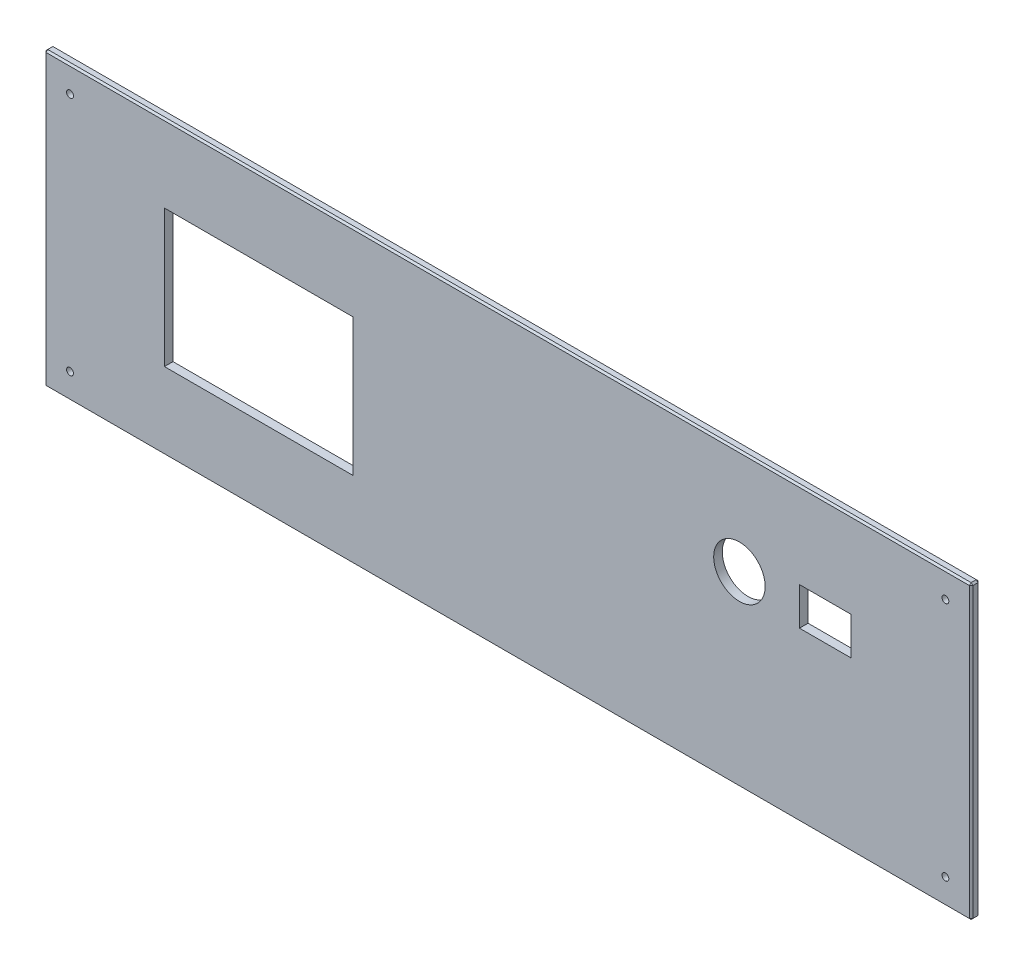
ISO-10303-21;
HEADER;
FILE_DESCRIPTION(('STEP AP214'),'2;1');
FILE_NAME('part.step','',(''),(''),'','','');
FILE_SCHEMA(('AUTOMOTIVE_DESIGN { 1 0 10303 214 1 1 1 1 }'));
ENDSEC;
DATA;
#1=APPLICATION_CONTEXT('core data for automotive mechanical design processes');
#2=APPLICATION_PROTOCOL_DEFINITION('international standard','automotive_design',2000,#1);
#3=PRODUCT_CONTEXT('',#1,'mechanical');
#4=PRODUCT('Part','Part','',(#3));
#5=PRODUCT_RELATED_PRODUCT_CATEGORY('part','',(#4));
#6=PRODUCT_DEFINITION_FORMATION('','',#4);
#7=PRODUCT_DEFINITION_CONTEXT('part definition',#1,'design');
#8=PRODUCT_DEFINITION('design','',#6,#7);
#9=PRODUCT_DEFINITION_SHAPE('','',#8);
#10=(LENGTH_UNIT() NAMED_UNIT(*) SI_UNIT(.MILLI.,.METRE.));
#11=(NAMED_UNIT(*) PLANE_ANGLE_UNIT() SI_UNIT($,.RADIAN.));
#12=(NAMED_UNIT(*) SI_UNIT($,.STERADIAN.) SOLID_ANGLE_UNIT());
#13=UNCERTAINTY_MEASURE_WITH_UNIT(LENGTH_MEASURE(1.E-05),#10,'distance_accuracy_value','');
#14=(GEOMETRIC_REPRESENTATION_CONTEXT(3) GLOBAL_UNCERTAINTY_ASSIGNED_CONTEXT((#13)) GLOBAL_UNIT_ASSIGNED_CONTEXT((#10,
#11,#12)) REPRESENTATION_CONTEXT('',''));
#15=CARTESIAN_POINT('',(0.,0.,0.));
#16=DIRECTION('',(0.,0.,1.));
#17=DIRECTION('',(1.,0.,0.));
#18=AXIS2_PLACEMENT_3D('',#15,#16,#17);
#19=CARTESIAN_POINT('',(0.,0.,5.));
#20=DIRECTION('',(1.,0.,0.));
#21=DIRECTION('',(0.,0.,-1.));
#22=AXIS2_PLACEMENT_3D('',#19,#20,#21);
#23=PLANE('',#22);
#24=DIRECTION('',(0.,0.,-1.));
#25=VECTOR('',#24,1.);
#26=CARTESIAN_POINT('',(0.,169.,5.));
#27=LINE('',#26,#25);
#28=CARTESIAN_POINT('',(0.,169.,4.));
#29=VERTEX_POINT('',#28);
#30=CARTESIAN_POINT('',(0.,169.,0.99999999999989));
#31=VERTEX_POINT('',#30);
#32=EDGE_CURVE('E373',#29,#31,#27,.T.);
#33=ORIENTED_EDGE('',*,*,#32,.T.);
#34=DIRECTION('',(0.,-1.,0.));
#35=VECTOR('',#34,1.);
#36=CARTESIAN_POINT('',(0.,0.,0.99999999999989));
#37=LINE('',#36,#35);
#38=CARTESIAN_POINT('',(0.,1.,0.99999999999989));
#39=VERTEX_POINT('',#38);
#40=EDGE_CURVE('E376',#31,#39,#37,.T.);
#41=ORIENTED_EDGE('',*,*,#40,.T.);
#42=DIRECTION('',(0.,0.,1.));
#43=VECTOR('',#42,1.);
#44=CARTESIAN_POINT('',(0.,1.,5.));
#45=LINE('',#44,#43);
#46=CARTESIAN_POINT('',(0.,1.,4.));
#47=VERTEX_POINT('',#46);
#48=EDGE_CURVE('E367',#39,#47,#45,.T.);
#49=ORIENTED_EDGE('',*,*,#48,.T.);
#50=DIRECTION('',(0.,1.,0.));
#51=VECTOR('',#50,1.);
#52=CARTESIAN_POINT('',(0.,0.,4.));
#53=LINE('',#52,#51);
#54=EDGE_CURVE('E370',#47,#29,#53,.T.);
#55=ORIENTED_EDGE('',*,*,#54,.T.);
#56=EDGE_LOOP('',(#33,#41,#49,#55));
#57=FACE_BOUND('',#56,.T.);
#58=ADVANCED_FACE('F40',(#57),#23,.F.);
#59=CARTESIAN_POINT('',(0.,0.,5.));
#60=DIRECTION('',(0.,1.,0.));
#61=DIRECTION('',(0.,0.,1.));
#62=AXIS2_PLACEMENT_3D('',#59,#60,#61);
#63=PLANE('',#62);
#64=DIRECTION('',(0.,0.,-1.));
#65=VECTOR('',#64,1.);
#66=CARTESIAN_POINT('',(0.99999999999989,0.,5.));
#67=LINE('',#66,#65);
#68=CARTESIAN_POINT('',(0.99999999999989,0.,4.));
#69=VERTEX_POINT('',#68);
#70=CARTESIAN_POINT('',(0.99999999999989,0.,0.99999999999989));
#71=VERTEX_POINT('',#70);
#72=EDGE_CURVE('E321',#69,#71,#67,.T.);
#73=ORIENTED_EDGE('',*,*,#72,.T.);
#74=DIRECTION('',(1.,0.,0.));
#75=VECTOR('',#74,1.);
#76=CARTESIAN_POINT('',(540.,0.,0.99999999999989));
#77=LINE('',#76,#75);
#78=CARTESIAN_POINT('',(539.,0.,0.99999999999989));
#79=VERTEX_POINT('',#78);
#80=EDGE_CURVE('E324',#71,#79,#77,.T.);
#81=ORIENTED_EDGE('',*,*,#80,.T.);
#82=DIRECTION('',(0.,0.,1.));
#83=VECTOR('',#82,1.);
#84=CARTESIAN_POINT('',(539.,0.,5.));
#85=LINE('',#84,#83);
#86=CARTESIAN_POINT('',(539.,0.,4.));
#87=VERTEX_POINT('',#86);
#88=EDGE_CURVE('E315',#79,#87,#85,.T.);
#89=ORIENTED_EDGE('',*,*,#88,.T.);
#90=DIRECTION('',(-1.,0.,0.));
#91=VECTOR('',#90,1.);
#92=CARTESIAN_POINT('',(0.,0.,4.));
#93=LINE('',#92,#91);
#94=EDGE_CURVE('E318',#87,#69,#93,.T.);
#95=ORIENTED_EDGE('',*,*,#94,.T.);
#96=EDGE_LOOP('',(#73,#81,#89,#95));
#97=FACE_BOUND('',#96,.T.);
#98=ADVANCED_FACE('F557',(#97),#63,.F.);
#99=CARTESIAN_POINT('',(540.,0.,5.));
#100=DIRECTION('',(-1.,0.,0.));
#101=DIRECTION('',(0.,0.,1.));
#102=AXIS2_PLACEMENT_3D('',#99,#100,#101);
#103=PLANE('',#102);
#104=DIRECTION('',(0.,0.,-1.));
#105=VECTOR('',#104,1.);
#106=CARTESIAN_POINT('',(540.,1.,5.));
#107=LINE('',#106,#105);
#108=CARTESIAN_POINT('',(540.,1.,4.));
#109=VERTEX_POINT('',#108);
#110=CARTESIAN_POINT('',(540.,1.,1.));
#111=VERTEX_POINT('',#110);
#112=EDGE_CURVE('E347',#109,#111,#107,.T.);
#113=ORIENTED_EDGE('',*,*,#112,.T.);
#114=DIRECTION('',(0.,1.,0.));
#115=VECTOR('',#114,1.);
#116=CARTESIAN_POINT('',(540.,170.,1.));
#117=LINE('',#116,#115);
#118=CARTESIAN_POINT('',(540.,169.,1.));
#119=VERTEX_POINT('',#118);
#120=EDGE_CURVE('E350',#111,#119,#117,.T.);
#121=ORIENTED_EDGE('',*,*,#120,.T.);
#122=DIRECTION('',(0.,0.,1.));
#123=VECTOR('',#122,1.);
#124=CARTESIAN_POINT('',(540.,169.,5.));
#125=LINE('',#124,#123);
#126=CARTESIAN_POINT('',(540.,169.,4.));
#127=VERTEX_POINT('',#126);
#128=EDGE_CURVE('E341',#119,#127,#125,.T.);
#129=ORIENTED_EDGE('',*,*,#128,.T.);
#130=DIRECTION('',(0.,-1.,0.));
#131=VECTOR('',#130,1.);
#132=CARTESIAN_POINT('',(540.,0.,4.));
#133=LINE('',#132,#131);
#134=EDGE_CURVE('E344',#127,#109,#133,.T.);
#135=ORIENTED_EDGE('',*,*,#134,.T.);
#136=EDGE_LOOP('',(#113,#121,#129,#135));
#137=FACE_BOUND('',#136,.T.);
#138=ADVANCED_FACE('F562',(#137),#103,.F.);
#139=CARTESIAN_POINT('',(0.,170.,5.));
#140=DIRECTION('',(0.,-1.,0.));
#141=DIRECTION('',(0.,0.,-1.));
#142=AXIS2_PLACEMENT_3D('',#139,#140,#141);
#143=PLANE('',#142);
#144=DIRECTION('',(-1.,0.,0.));
#145=VECTOR('',#144,1.);
#146=CARTESIAN_POINT('',(0.,170.,0.99999999999989));
#147=LINE('',#146,#145);
#148=CARTESIAN_POINT('',(539.,170.,0.99999999999989));
#149=VERTEX_POINT('',#148);
#150=CARTESIAN_POINT('',(0.99999999999989,170.,0.99999999999989));
#151=VERTEX_POINT('',#150);
#152=EDGE_CURVE('E360',#149,#151,#147,.T.);
#153=ORIENTED_EDGE('',*,*,#152,.T.);
#154=DIRECTION('',(0.,0.,1.));
#155=VECTOR('',#154,1.);
#156=CARTESIAN_POINT('',(0.99999999999989,170.,5.));
#157=LINE('',#156,#155);
#158=CARTESIAN_POINT('',(0.99999999999989,170.,4.00000000000011));
#159=VERTEX_POINT('',#158);
#160=EDGE_CURVE('E364',#151,#159,#157,.T.);
#161=ORIENTED_EDGE('',*,*,#160,.T.);
#162=DIRECTION('',(1.,0.,0.));
#163=VECTOR('',#162,1.);
#164=CARTESIAN_POINT('',(0.,170.,4.00000000000011));
#165=LINE('',#164,#163);
#166=CARTESIAN_POINT('',(539.,170.,4.00000000000011));
#167=VERTEX_POINT('',#166);
#168=EDGE_CURVE('E357',#159,#167,#165,.T.);
#169=ORIENTED_EDGE('',*,*,#168,.T.);
#170=DIRECTION('',(0.,0.,-1.));
#171=VECTOR('',#170,1.);
#172=CARTESIAN_POINT('',(539.,170.,5.));
#173=LINE('',#172,#171);
#174=EDGE_CURVE('E354',#167,#149,#173,.T.);
#175=ORIENTED_EDGE('',*,*,#174,.T.);
#176=EDGE_LOOP('',(#153,#161,#169,#175));
#177=FACE_BOUND('',#176,.T.);
#178=ADVANCED_FACE('F525',(#177),#143,.F.);
#179=CARTESIAN_POINT('',(0.,0.,5.));
#180=DIRECTION('',(0.,0.,-1.));
#181=DIRECTION('',(-1.,0.,0.));
#182=AXIS2_PLACEMENT_3D('',#179,#180,#181);
#183=PLANE('',#182);
#184=DIRECTION('',(1.,0.,0.));
#185=VECTOR('',#184,1.);
#186=CARTESIAN_POINT('',(0.,120.,5.));
#187=LINE('',#186,#185);
#188=CARTESIAN_POINT('',(440.,120.,5.));
#189=VERTEX_POINT('',#188);
#190=CARTESIAN_POINT('',(470.,120.,5.));
#191=VERTEX_POINT('',#190);
#192=EDGE_CURVE('E274',#189,#191,#187,.T.);
#193=ORIENTED_EDGE('',*,*,#192,.T.);
#194=DIRECTION('',(0.,-1.,0.));
#195=VECTOR('',#194,1.);
#196=CARTESIAN_POINT('',(470.,0.,5.));
#197=LINE('',#196,#195);
#198=CARTESIAN_POINT('',(470.,98.,5.));
#199=VERTEX_POINT('',#198);
#200=EDGE_CURVE('E278',#191,#199,#197,.T.);
#201=ORIENTED_EDGE('',*,*,#200,.T.);
#202=DIRECTION('',(-1.,0.,0.));
#203=VECTOR('',#202,1.);
#204=CARTESIAN_POINT('',(0.,98.,5.));
#205=LINE('',#204,#203);
#206=CARTESIAN_POINT('',(440.,98.,5.));
#207=VERTEX_POINT('',#206);
#208=EDGE_CURVE('E269',#199,#207,#205,.T.);
#209=ORIENTED_EDGE('',*,*,#208,.T.);
#210=DIRECTION('',(0.,1.,0.));
#211=VECTOR('',#210,1.);
#212=CARTESIAN_POINT('',(440.,0.,5.));
#213=LINE('',#212,#211);
#214=EDGE_CURVE('E186',#207,#189,#213,.T.);
#215=ORIENTED_EDGE('',*,*,#214,.T.);
#216=EDGE_LOOP('',(#193,#201,#209,#215));
#217=FACE_BOUND('',#216,.T.);
#218=CARTESIAN_POINT('',(405.,109.,5.));
#219=DIRECTION('',(0.,0.,-1.));
#220=DIRECTION('',(-1.,0.,0.));
#221=AXIS2_PLACEMENT_3D('',#218,#219,#220);
#222=CIRCLE('',#221,15.);
#223=CARTESIAN_POINT('',(390.,109.,5.));
#224=VERTEX_POINT('',#223);
#225=EDGE_CURVE('E265',#224,#224,#222,.T.);
#226=ORIENTED_EDGE('',*,*,#225,.T.);
#227=EDGE_LOOP('',(#226));
#228=FACE_BOUND('',#227,.T.);
#229=DIRECTION('',(1.,0.,0.));
#230=VECTOR('',#229,1.);
#231=CARTESIAN_POINT('',(0.,125.,5.));
#232=LINE('',#231,#230);
#233=CARTESIAN_POINT('',(70.0000000000001,125.,5.));
#234=VERTEX_POINT('',#233);
#235=CARTESIAN_POINT('',(180.,125.,5.));
#236=VERTEX_POINT('',#235);
#237=EDGE_CURVE('E257',#234,#236,#232,.T.);
#238=ORIENTED_EDGE('',*,*,#237,.T.);
#239=DIRECTION('',(0.,-1.,0.));
#240=VECTOR('',#239,1.);
#241=CARTESIAN_POINT('',(180.,0.,5.));
#242=LINE('',#241,#240);
#243=CARTESIAN_POINT('',(180.,45.,5.));
#244=VERTEX_POINT('',#243);
#245=EDGE_CURVE('E261',#236,#244,#242,.T.);
#246=ORIENTED_EDGE('',*,*,#245,.T.);
#247=DIRECTION('',(-1.,0.,0.));
#248=VECTOR('',#247,1.);
#249=CARTESIAN_POINT('',(0.,45.,5.));
#250=LINE('',#249,#248);
#251=CARTESIAN_POINT('',(70.0000000000001,45.,5.));
#252=VERTEX_POINT('',#251);
#253=EDGE_CURVE('E215',#244,#252,#250,.T.);
#254=ORIENTED_EDGE('',*,*,#253,.T.);
#255=DIRECTION('',(0.,1.,0.));
#256=VECTOR('',#255,1.);
#257=CARTESIAN_POINT('',(70.,0.,5.));
#258=LINE('',#257,#256);
#259=EDGE_CURVE('E253',#252,#234,#258,.T.);
#260=ORIENTED_EDGE('',*,*,#259,.T.);
#261=EDGE_LOOP('',(#238,#246,#254,#260));
#262=FACE_BOUND('',#261,.T.);
#263=CARTESIAN_POINT('',(525.,15.,5.));
#264=DIRECTION('',(0.,0.,1.));
#265=DIRECTION('',(1.,0.,0.));
#266=AXIS2_PLACEMENT_3D('',#263,#264,#265);
#267=CIRCLE('',#266,2.);
#268=CARTESIAN_POINT('',(527.,15.,5.));
#269=VERTEX_POINT('',#268);
#270=EDGE_CURVE('E296',#269,#269,#267,.T.);
#271=ORIENTED_EDGE('',*,*,#270,.F.);
#272=EDGE_LOOP('',(#271));
#273=FACE_BOUND('',#272,.T.);
#274=CARTESIAN_POINT('',(15.,155.,5.));
#275=DIRECTION('',(0.,0.,1.));
#276=DIRECTION('',(1.,0.,0.));
#277=AXIS2_PLACEMENT_3D('',#274,#275,#276);
#278=CIRCLE('',#277,2.00000000000001);
#279=CARTESIAN_POINT('',(17.,155.,5.));
#280=VERTEX_POINT('',#279);
#281=EDGE_CURVE('E287',#280,#280,#278,.T.);
#282=ORIENTED_EDGE('',*,*,#281,.F.);
#283=EDGE_LOOP('',(#282));
#284=FACE_BOUND('',#283,.T.);
#285=CARTESIAN_POINT('',(15.,15.,5.));
#286=DIRECTION('',(0.,0.,1.));
#287=DIRECTION('',(1.,0.,0.));
#288=AXIS2_PLACEMENT_3D('',#285,#286,#287);
#289=CIRCLE('',#288,2.00000000000001);
#290=CARTESIAN_POINT('',(17.,15.,5.));
#291=VERTEX_POINT('',#290);
#292=EDGE_CURVE('E282',#291,#291,#289,.T.);
#293=ORIENTED_EDGE('',*,*,#292,.F.);
#294=EDGE_LOOP('',(#293));
#295=FACE_BOUND('',#294,.T.);
#296=CARTESIAN_POINT('',(525.,155.,5.));
#297=DIRECTION('',(0.,0.,1.));
#298=DIRECTION('',(1.,0.,0.));
#299=AXIS2_PLACEMENT_3D('',#296,#297,#298);
#300=CIRCLE('',#299,2.);
#301=CARTESIAN_POINT('',(527.,155.,5.));
#302=VERTEX_POINT('',#301);
#303=EDGE_CURVE('E295',#302,#302,#300,.T.);
#304=ORIENTED_EDGE('',*,*,#303,.F.);
#305=EDGE_LOOP('',(#304));
#306=FACE_BOUND('',#305,.T.);
#307=DIRECTION('',(0.,1.,0.));
#308=VECTOR('',#307,1.);
#309=CARTESIAN_POINT('',(539.,0.,5.));
#310=LINE('',#309,#308);
#311=CARTESIAN_POINT('',(539.,0.99999999999989,5.));
#312=VERTEX_POINT('',#311);
#313=CARTESIAN_POINT('',(539.,169.,5.));
#314=VERTEX_POINT('',#313);
#315=EDGE_CURVE('E380',#312,#314,#310,.T.);
#316=ORIENTED_EDGE('',*,*,#315,.T.);
#317=DIRECTION('',(-1.,0.,0.));
#318=VECTOR('',#317,1.);
#319=CARTESIAN_POINT('',(0.,169.,5.));
#320=LINE('',#319,#318);
#321=CARTESIAN_POINT('',(0.99999999999989,169.,5.));
#322=VERTEX_POINT('',#321);
#323=EDGE_CURVE('E11',#314,#322,#320,.T.);
#324=ORIENTED_EDGE('',*,*,#323,.T.);
#325=DIRECTION('',(0.,-1.,0.));
#326=VECTOR('',#325,1.);
#327=CARTESIAN_POINT('',(0.99999999999989,0.,5.));
#328=LINE('',#327,#326);
#329=CARTESIAN_POINT('',(0.99999999999989,0.99999999999989,5.));
#330=VERTEX_POINT('',#329);
#331=EDGE_CURVE('E51',#322,#330,#328,.T.);
#332=ORIENTED_EDGE('',*,*,#331,.T.);
#333=DIRECTION('',(1.,0.,0.));
#334=VECTOR('',#333,1.);
#335=CARTESIAN_POINT('',(0.,0.99999999999989,5.));
#336=LINE('',#335,#334);
#337=EDGE_CURVE('E383',#330,#312,#336,.T.);
#338=ORIENTED_EDGE('',*,*,#337,.T.);
#339=EDGE_LOOP('',(#316,#324,#332,#338));
#340=FACE_BOUND('',#339,.T.);
#341=ADVANCED_FACE('F501',(#217,#228,#262,#273,#284,#295,#306,#340),#183,.F.);
#342=CARTESIAN_POINT('',(0.,0.,0.));
#343=DIRECTION('',(0.,0.,-1.));
#344=DIRECTION('',(-1.,0.,0.));
#345=AXIS2_PLACEMENT_3D('',#342,#343,#344);
#346=PLANE('',#345);
#347=DIRECTION('',(0.,-1.,0.));
#348=VECTOR('',#347,1.);
#349=CARTESIAN_POINT('',(470.,120.,0.));
#350=LINE('',#349,#348);
#351=CARTESIAN_POINT('',(470.,120.,0.));
#352=VERTEX_POINT('',#351);
#353=CARTESIAN_POINT('',(470.,98.,0.));
#354=VERTEX_POINT('',#353);
#355=EDGE_CURVE('E200',#352,#354,#350,.T.);
#356=ORIENTED_EDGE('',*,*,#355,.F.);
#357=DIRECTION('',(1.,0.,0.));
#358=VECTOR('',#357,1.);
#359=CARTESIAN_POINT('',(470.,120.,0.));
#360=LINE('',#359,#358);
#361=CARTESIAN_POINT('',(440.,120.,0.));
#362=VERTEX_POINT('',#361);
#363=EDGE_CURVE('E205',#362,#352,#360,.T.);
#364=ORIENTED_EDGE('',*,*,#363,.F.);
#365=DIRECTION('',(0.,1.,0.));
#366=VECTOR('',#365,1.);
#367=CARTESIAN_POINT('',(440.,120.,0.));
#368=LINE('',#367,#366);
#369=CARTESIAN_POINT('',(440.,98.,0.));
#370=VERTEX_POINT('',#369);
#371=EDGE_CURVE('E183',#370,#362,#368,.T.);
#372=ORIENTED_EDGE('',*,*,#371,.F.);
#373=DIRECTION('',(-1.,0.,0.));
#374=VECTOR('',#373,1.);
#375=CARTESIAN_POINT('',(470.,98.,0.));
#376=LINE('',#375,#374);
#377=EDGE_CURVE('E194',#354,#370,#376,.T.);
#378=ORIENTED_EDGE('',*,*,#377,.F.);
#379=EDGE_LOOP('',(#356,#364,#372,#378));
#380=FACE_BOUND('',#379,.T.);
#381=CARTESIAN_POINT('',(405.,109.,0.));
#382=DIRECTION('',(0.,0.,-1.));
#383=DIRECTION('',(-1.,0.,0.));
#384=AXIS2_PLACEMENT_3D('',#381,#382,#383);
#385=CIRCLE('',#384,15.);
#386=CARTESIAN_POINT('',(390.,109.,0.));
#387=VERTEX_POINT('',#386);
#388=EDGE_CURVE('E220',#387,#387,#385,.T.);
#389=ORIENTED_EDGE('',*,*,#388,.F.);
#390=EDGE_LOOP('',(#389));
#391=FACE_BOUND('',#390,.T.);
#392=DIRECTION('',(0.,-1.,0.));
#393=VECTOR('',#392,1.);
#394=CARTESIAN_POINT('',(180.,125.,0.));
#395=LINE('',#394,#393);
#396=CARTESIAN_POINT('',(180.,125.,0.));
#397=VERTEX_POINT('',#396);
#398=CARTESIAN_POINT('',(180.,45.,0.));
#399=VERTEX_POINT('',#398);
#400=EDGE_CURVE('E225',#397,#399,#395,.T.);
#401=ORIENTED_EDGE('',*,*,#400,.F.);
#402=DIRECTION('',(1.,0.,0.));
#403=VECTOR('',#402,1.);
#404=CARTESIAN_POINT('',(180.,125.,0.));
#405=LINE('',#404,#403);
#406=CARTESIAN_POINT('',(70.0000000000001,125.,0.));
#407=VERTEX_POINT('',#406);
#408=EDGE_CURVE('E235',#407,#397,#405,.T.);
#409=ORIENTED_EDGE('',*,*,#408,.F.);
#410=DIRECTION('',(0.,1.,0.));
#411=VECTOR('',#410,1.);
#412=CARTESIAN_POINT('',(70.0000000000001,125.,0.));
#413=LINE('',#412,#411);
#414=CARTESIAN_POINT('',(70.0000000000001,45.,0.));
#415=VERTEX_POINT('',#414);
#416=EDGE_CURVE('E231',#415,#407,#413,.T.);
#417=ORIENTED_EDGE('',*,*,#416,.F.);
#418=DIRECTION('',(-1.,0.,0.));
#419=VECTOR('',#418,1.);
#420=CARTESIAN_POINT('',(180.,45.,0.));
#421=LINE('',#420,#419);
#422=EDGE_CURVE('E228',#399,#415,#421,.T.);
#423=ORIENTED_EDGE('',*,*,#422,.F.);
#424=EDGE_LOOP('',(#401,#409,#417,#423));
#425=FACE_BOUND('',#424,.T.);
#426=CARTESIAN_POINT('',(525.,15.,0.));
#427=DIRECTION('',(0.,0.,1.));
#428=DIRECTION('',(1.,0.,0.));
#429=AXIS2_PLACEMENT_3D('',#426,#427,#428);
#430=CIRCLE('',#429,2.);
#431=CARTESIAN_POINT('',(527.,15.,0.));
#432=VERTEX_POINT('',#431);
#433=EDGE_CURVE('E291',#432,#432,#430,.T.);
#434=ORIENTED_EDGE('',*,*,#433,.T.);
#435=EDGE_LOOP('',(#434));
#436=FACE_BOUND('',#435,.T.);
#437=CARTESIAN_POINT('',(15.,155.,0.));
#438=DIRECTION('',(0.,0.,1.));
#439=DIRECTION('',(1.,0.,0.));
#440=AXIS2_PLACEMENT_3D('',#437,#438,#439);
#441=CIRCLE('',#440,2.00000000000001);
#442=CARTESIAN_POINT('',(17.,155.,0.));
#443=VERTEX_POINT('',#442);
#444=EDGE_CURVE('E300',#443,#443,#441,.T.);
#445=ORIENTED_EDGE('',*,*,#444,.T.);
#446=EDGE_LOOP('',(#445));
#447=FACE_BOUND('',#446,.T.);
#448=CARTESIAN_POINT('',(15.,15.,0.));
#449=DIRECTION('',(0.,0.,1.));
#450=DIRECTION('',(1.,0.,0.));
#451=AXIS2_PLACEMENT_3D('',#448,#449,#450);
#452=CIRCLE('',#451,2.00000000000001);
#453=CARTESIAN_POINT('',(17.,15.,0.));
#454=VERTEX_POINT('',#453);
#455=EDGE_CURVE('E283',#454,#454,#452,.T.);
#456=ORIENTED_EDGE('',*,*,#455,.T.);
#457=EDGE_LOOP('',(#456));
#458=FACE_BOUND('',#457,.T.);
#459=CARTESIAN_POINT('',(525.,155.,0.));
#460=DIRECTION('',(0.,0.,1.));
#461=DIRECTION('',(1.,0.,0.));
#462=AXIS2_PLACEMENT_3D('',#459,#460,#461);
#463=CIRCLE('',#462,2.);
#464=CARTESIAN_POINT('',(527.,155.,0.));
#465=VERTEX_POINT('',#464);
#466=EDGE_CURVE('E307',#465,#465,#463,.T.);
#467=ORIENTED_EDGE('',*,*,#466,.T.);
#468=EDGE_LOOP('',(#467));
#469=FACE_BOUND('',#468,.T.);
#470=DIRECTION('',(0.,-1.,0.));
#471=VECTOR('',#470,1.);
#472=CARTESIAN_POINT('',(539.,0.,0.));
#473=LINE('',#472,#471);
#474=CARTESIAN_POINT('',(539.,169.,0.));
#475=VERTEX_POINT('',#474);
#476=CARTESIAN_POINT('',(539.,1.,0.));
#477=VERTEX_POINT('',#476);
#478=EDGE_CURVE('E334',#475,#477,#473,.T.);
#479=ORIENTED_EDGE('',*,*,#478,.T.);
#480=DIRECTION('',(-1.,0.,0.));
#481=VECTOR('',#480,1.);
#482=CARTESIAN_POINT('',(0.,1.,0.));
#483=LINE('',#482,#481);
#484=CARTESIAN_POINT('',(1.,1.,0.));
#485=VERTEX_POINT('',#484);
#486=EDGE_CURVE('E337',#477,#485,#483,.T.);
#487=ORIENTED_EDGE('',*,*,#486,.T.);
#488=DIRECTION('',(0.,1.,0.));
#489=VECTOR('',#488,1.);
#490=CARTESIAN_POINT('',(1.,170.,0.));
#491=LINE('',#490,#489);
#492=CARTESIAN_POINT('',(1.,169.,0.));
#493=VERTEX_POINT('',#492);
#494=EDGE_CURVE('E328',#485,#493,#491,.T.);
#495=ORIENTED_EDGE('',*,*,#494,.T.);
#496=DIRECTION('',(1.,0.,0.));
#497=VECTOR('',#496,1.);
#498=CARTESIAN_POINT('',(540.,169.,0.));
#499=LINE('',#498,#497);
#500=EDGE_CURVE('E331',#493,#475,#499,.T.);
#501=ORIENTED_EDGE('',*,*,#500,.T.);
#502=EDGE_LOOP('',(#479,#487,#495,#501));
#503=FACE_BOUND('',#502,.T.);
#504=ADVANCED_FACE('F202',(#380,#391,#425,#436,#447,#458,#469,#503),#346,.T.);
#505=CARTESIAN_POINT('',(0.,169.,5.));
#506=DIRECTION('',(0.,-0.707106781186508,-0.707106781186587));
#507=DIRECTION('',(-1.,0.,0.));
#508=AXIS2_PLACEMENT_3D('',#505,#506,#507);
#509=PLANE('',#508);
#510=DIRECTION('',(0.,-0.707106781186587,0.707106781186508));
#511=VECTOR('',#510,1.);
#512=CARTESIAN_POINT('',(0.99999999999989,169.,5.));
#513=LINE('',#512,#511);
#514=EDGE_CURVE('E45',#322,#159,#513,.F.);
#515=ORIENTED_EDGE('',*,*,#514,.F.);
#516=ORIENTED_EDGE('',*,*,#323,.F.);
#517=DIRECTION('',(0.,0.707106781186587,-0.707106781186508));
#518=VECTOR('',#517,1.);
#519=CARTESIAN_POINT('',(539.,170.,4.00000000000011));
#520=LINE('',#519,#518);
#521=EDGE_CURVE('E469',#167,#314,#520,.F.);
#522=ORIENTED_EDGE('',*,*,#521,.F.);
#523=ORIENTED_EDGE('',*,*,#168,.F.);
#524=EDGE_LOOP('',(#515,#516,#522,#523));
#525=FACE_BOUND('',#524,.T.);
#526=ADVANCED_FACE('F43',(#525),#509,.F.);
#527=CARTESIAN_POINT('',(0.99999999999989,169.,5.));
#528=DIRECTION('',(-0.57735026918969,0.577350269189562,0.577350269189626));
#529=DIRECTION('',(0.707106781186508,0.,0.707106781186587));
#530=AXIS2_PLACEMENT_3D('',#527,#528,#529);
#531=PLANE('',#530);
#532=DIRECTION('',(-0.707106781186508,0.,-0.707106781186587));
#533=VECTOR('',#532,1.);
#534=CARTESIAN_POINT('',(0.99999999999989,169.,5.));
#535=LINE('',#534,#533);
#536=EDGE_CURVE('E462',#322,#29,#535,.T.);
#537=ORIENTED_EDGE('',*,*,#536,.F.);
#538=ORIENTED_EDGE('',*,*,#514,.T.);
#539=DIRECTION('',(0.707106781186508,0.707106781186587,0.));
#540=VECTOR('',#539,1.);
#541=CARTESIAN_POINT('',(0.499999999999945,169.5,4.00000000000006));
#542=LINE('',#541,#540);
#543=EDGE_CURVE('E466',#29,#159,#542,.T.);
#544=ORIENTED_EDGE('',*,*,#543,.F.);
#545=EDGE_LOOP('',(#537,#538,#544));
#546=FACE_BOUND('',#545,.T.);
#547=ADVANCED_FACE('F482',(#546),#531,.T.);
#548=CARTESIAN_POINT('',(539.,170.,4.00000000000011));
#549=DIRECTION('',(0.57735026918969,0.577350269189562,0.577350269189626));
#550=DIRECTION('',(0.707106781186508,0.,-0.707106781186587));
#551=AXIS2_PLACEMENT_3D('',#548,#549,#550);
#552=PLANE('',#551);
#553=DIRECTION('',(0.707106781186508,-0.707106781186587,0.));
#554=VECTOR('',#553,1.);
#555=CARTESIAN_POINT('',(539.,170.,4.00000000000011));
#556=LINE('',#555,#554);
#557=EDGE_CURVE('E454',#167,#127,#556,.T.);
#558=ORIENTED_EDGE('',*,*,#557,.F.);
#559=ORIENTED_EDGE('',*,*,#521,.T.);
#560=DIRECTION('',(-0.707106781186508,0.,0.707106781186587));
#561=VECTOR('',#560,1.);
#562=CARTESIAN_POINT('',(539.5,169.,4.5));
#563=LINE('',#562,#561);
#564=EDGE_CURVE('E458',#127,#314,#563,.T.);
#565=ORIENTED_EDGE('',*,*,#564,.F.);
#566=EDGE_LOOP('',(#558,#559,#565));
#567=FACE_BOUND('',#566,.T.);
#568=ADVANCED_FACE('F518',(#567),#552,.T.);
#569=CARTESIAN_POINT('',(0.,169.,5.));
#570=DIRECTION('',(0.707106781186587,-0.707106781186508,0.));
#571=DIRECTION('',(0.,0.,-1.));
#572=AXIS2_PLACEMENT_3D('',#569,#570,#571);
#573=PLANE('',#572);
#574=ORIENTED_EDGE('',*,*,#543,.T.);
#575=ORIENTED_EDGE('',*,*,#160,.F.);
#576=DIRECTION('',(-0.707106781186508,-0.707106781186587,0.));
#577=VECTOR('',#576,1.);
#578=CARTESIAN_POINT('',(0.99999999999989,170.,0.99999999999989));
#579=LINE('',#578,#577);
#580=EDGE_CURVE('E447',#31,#151,#579,.F.);
#581=ORIENTED_EDGE('',*,*,#580,.F.);
#582=ORIENTED_EDGE('',*,*,#32,.F.);
#583=EDGE_LOOP('',(#574,#575,#581,#582));
#584=FACE_BOUND('',#583,.T.);
#585=ADVANCED_FACE('F489',(#584),#573,.F.);
#586=CARTESIAN_POINT('',(0.99999999999989,0.,5.));
#587=DIRECTION('',(0.707106781186587,0.,-0.707106781186508));
#588=DIRECTION('',(0.,-1.,0.));
#589=AXIS2_PLACEMENT_3D('',#586,#587,#588);
#590=PLANE('',#589);
#591=ORIENTED_EDGE('',*,*,#536,.T.);
#592=ORIENTED_EDGE('',*,*,#54,.F.);
#593=DIRECTION('',(0.707106781186508,0.,0.707106781186587));
#594=VECTOR('',#593,1.);
#595=CARTESIAN_POINT('',(0.99999999999989,0.99999999999989,5.));
#596=LINE('',#595,#594);
#597=EDGE_CURVE('E443',#330,#47,#596,.F.);
#598=ORIENTED_EDGE('',*,*,#597,.F.);
#599=ORIENTED_EDGE('',*,*,#331,.F.);
#600=EDGE_LOOP('',(#591,#592,#598,#599));
#601=FACE_BOUND('',#600,.T.);
#602=ADVANCED_FACE('F498',(#601),#590,.F.);
#603=CARTESIAN_POINT('',(0.,0.99999999999989,5.));
#604=DIRECTION('',(0.,0.707106781186587,-0.707106781186508));
#605=DIRECTION('',(1.,0.,0.));
#606=AXIS2_PLACEMENT_3D('',#603,#604,#605);
#607=PLANE('',#606);
#608=DIRECTION('',(0.,0.707106781186508,0.707106781186587));
#609=VECTOR('',#608,1.);
#610=CARTESIAN_POINT('',(539.,0.99999999999989,5.));
#611=LINE('',#610,#609);
#612=EDGE_CURVE('E435',#312,#87,#611,.F.);
#613=ORIENTED_EDGE('',*,*,#612,.F.);
#614=ORIENTED_EDGE('',*,*,#337,.F.);
#615=DIRECTION('',(0.,-0.707106781186508,-0.707106781186587));
#616=VECTOR('',#615,1.);
#617=CARTESIAN_POINT('',(0.99999999999989,0.99999999999989,5.));
#618=LINE('',#617,#616);
#619=EDGE_CURVE('E439',#69,#330,#618,.F.);
#620=ORIENTED_EDGE('',*,*,#619,.F.);
#621=ORIENTED_EDGE('',*,*,#94,.F.);
#622=EDGE_LOOP('',(#613,#614,#620,#621));
#623=FACE_BOUND('',#622,.T.);
#624=ADVANCED_FACE('F506',(#623),#607,.F.);
#625=CARTESIAN_POINT('',(539.,0.,5.));
#626=DIRECTION('',(-0.707106781186587,0.,-0.707106781186508));
#627=DIRECTION('',(0.,1.,0.));
#628=AXIS2_PLACEMENT_3D('',#625,#626,#627);
#629=PLANE('',#628);
#630=ORIENTED_EDGE('',*,*,#564,.T.);
#631=ORIENTED_EDGE('',*,*,#315,.F.);
#632=DIRECTION('',(0.707106781186508,0.,-0.707106781186587));
#633=VECTOR('',#632,1.);
#634=CARTESIAN_POINT('',(539.,0.99999999999989,5.));
#635=LINE('',#634,#633);
#636=EDGE_CURVE('E431',#109,#312,#635,.F.);
#637=ORIENTED_EDGE('',*,*,#636,.F.);
#638=ORIENTED_EDGE('',*,*,#134,.F.);
#639=EDGE_LOOP('',(#630,#631,#637,#638));
#640=FACE_BOUND('',#639,.T.);
#641=ADVANCED_FACE('F516',(#640),#629,.F.);
#642=CARTESIAN_POINT('',(539.,170.,5.));
#643=DIRECTION('',(-0.707106781186587,-0.707106781186508,0.));
#644=DIRECTION('',(0.,0.,-1.));
#645=AXIS2_PLACEMENT_3D('',#642,#643,#644);
#646=PLANE('',#645);
#647=ORIENTED_EDGE('',*,*,#557,.T.);
#648=ORIENTED_EDGE('',*,*,#128,.F.);
#649=DIRECTION('',(-0.707106781186508,0.707106781186587,0.));
#650=VECTOR('',#649,1.);
#651=CARTESIAN_POINT('',(540.,169.,1.));
#652=LINE('',#651,#650);
#653=EDGE_CURVE('E427',#149,#119,#652,.F.);
#654=ORIENTED_EDGE('',*,*,#653,.F.);
#655=ORIENTED_EDGE('',*,*,#174,.F.);
#656=EDGE_LOOP('',(#647,#648,#654,#655));
#657=FACE_BOUND('',#656,.T.);
#658=ADVANCED_FACE('F522',(#657),#646,.F.);
#659=CARTESIAN_POINT('',(0.,170.,0.99999999999989));
#660=DIRECTION('',(0.,0.707106781186508,-0.707106781186587));
#661=DIRECTION('',(1.,0.,0.));
#662=AXIS2_PLACEMENT_3D('',#659,#660,#661);
#663=PLANE('',#662);
#664=DIRECTION('',(0.,-0.707106781186587,-0.707106781186508));
#665=VECTOR('',#664,1.);
#666=CARTESIAN_POINT('',(0.99999999999989,170.,0.99999999999989));
#667=LINE('',#666,#665);
#668=EDGE_CURVE('E450',#151,#493,#667,.T.);
#669=ORIENTED_EDGE('',*,*,#668,.F.);
#670=ORIENTED_EDGE('',*,*,#152,.F.);
#671=DIRECTION('',(0.,0.707106781186587,0.707106781186508));
#672=VECTOR('',#671,1.);
#673=CARTESIAN_POINT('',(539.,169.5,0.499999999999945));
#674=LINE('',#673,#672);
#675=EDGE_CURVE('E423',#475,#149,#674,.T.);
#676=ORIENTED_EDGE('',*,*,#675,.F.);
#677=ORIENTED_EDGE('',*,*,#500,.F.);
#678=EDGE_LOOP('',(#669,#670,#676,#677));
#679=FACE_BOUND('',#678,.T.);
#680=ADVANCED_FACE('F529',(#679),#663,.T.);
#681=CARTESIAN_POINT('',(0.99999999999989,170.,0.99999999999989));
#682=DIRECTION('',(-0.577350269189626,0.577350269189562,-0.57735026918969));
#683=DIRECTION('',(-0.707106781186587,0.,0.707106781186508));
#684=AXIS2_PLACEMENT_3D('',#681,#682,#683);
#685=PLANE('',#684);
#686=ORIENTED_EDGE('',*,*,#580,.T.);
#687=ORIENTED_EDGE('',*,*,#668,.T.);
#688=DIRECTION('',(-0.707106781186587,0.,0.707106781186508));
#689=VECTOR('',#688,1.);
#690=CARTESIAN_POINT('',(0.5,169.,0.499999999999945));
#691=LINE('',#690,#689);
#692=EDGE_CURVE('E419',#31,#493,#691,.F.);
#693=ORIENTED_EDGE('',*,*,#692,.F.);
#694=EDGE_LOOP('',(#686,#687,#693));
#695=FACE_BOUND('',#694,.T.);
#696=ADVANCED_FACE('F533',(#695),#685,.T.);
#697=CARTESIAN_POINT('',(0.99999999999989,0.99999999999989,5.));
#698=DIRECTION('',(-0.57735026918969,-0.577350269189626,0.577350269189562));
#699=DIRECTION('',(0.707106781186508,-0.707106781186587,0.));
#700=AXIS2_PLACEMENT_3D('',#697,#698,#699);
#701=PLANE('',#700);
#702=ORIENTED_EDGE('',*,*,#619,.T.);
#703=ORIENTED_EDGE('',*,*,#597,.T.);
#704=DIRECTION('',(-0.707106781186508,0.707106781186587,0.));
#705=VECTOR('',#704,1.);
#706=CARTESIAN_POINT('',(0.499999999999945,0.5,4.));
#707=LINE('',#706,#705);
#708=EDGE_CURVE('E415',#69,#47,#707,.T.);
#709=ORIENTED_EDGE('',*,*,#708,.F.);
#710=EDGE_LOOP('',(#702,#703,#709));
#711=FACE_BOUND('',#710,.T.);
#712=ADVANCED_FACE('F545',(#711),#701,.T.);
#713=CARTESIAN_POINT('',(539.,0.99999999999989,5.));
#714=DIRECTION('',(0.57735026918969,-0.577350269189626,0.577350269189562));
#715=DIRECTION('',(0.707106781186508,0.707106781186587,0.));
#716=AXIS2_PLACEMENT_3D('',#713,#714,#715);
#717=PLANE('',#716);
#718=ORIENTED_EDGE('',*,*,#636,.T.);
#719=ORIENTED_EDGE('',*,*,#612,.T.);
#720=DIRECTION('',(-0.707106781186508,-0.707106781186587,0.));
#721=VECTOR('',#720,1.);
#722=CARTESIAN_POINT('',(539.5,0.500000000000001,4.));
#723=LINE('',#722,#721);
#724=EDGE_CURVE('E411',#109,#87,#723,.T.);
#725=ORIENTED_EDGE('',*,*,#724,.F.);
#726=EDGE_LOOP('',(#718,#719,#725));
#727=FACE_BOUND('',#726,.T.);
#728=ADVANCED_FACE('F512',(#727),#717,.T.);
#729=CARTESIAN_POINT('',(540.,169.,1.));
#730=DIRECTION('',(0.57735026918969,0.577350269189562,-0.577350269189626));
#731=DIRECTION('',(-0.707106781186508,0.,-0.707106781186587));
#732=AXIS2_PLACEMENT_3D('',#729,#730,#731);
#733=PLANE('',#732);
#734=ORIENTED_EDGE('',*,*,#675,.T.);
#735=ORIENTED_EDGE('',*,*,#653,.T.);
#736=DIRECTION('',(-0.707106781186508,0.,-0.707106781186587));
#737=VECTOR('',#736,1.);
#738=CARTESIAN_POINT('',(540.,169.,1.));
#739=LINE('',#738,#737);
#740=EDGE_CURVE('E408',#475,#119,#739,.F.);
#741=ORIENTED_EDGE('',*,*,#740,.F.);
#742=EDGE_LOOP('',(#734,#735,#741));
#743=FACE_BOUND('',#742,.T.);
#744=ADVANCED_FACE('F552',(#743),#733,.T.);
#745=CARTESIAN_POINT('',(0.,0.,0.99999999999989));
#746=DIRECTION('',(-0.707106781186508,0.,-0.707106781186587));
#747=DIRECTION('',(0.,1.,0.));
#748=AXIS2_PLACEMENT_3D('',#745,#746,#747);
#749=PLANE('',#748);
#750=ORIENTED_EDGE('',*,*,#692,.T.);
#751=ORIENTED_EDGE('',*,*,#494,.F.);
#752=DIRECTION('',(0.707106781186587,0.,-0.707106781186508));
#753=VECTOR('',#752,1.);
#754=CARTESIAN_POINT('',(1.,1.,0.));
#755=LINE('',#754,#753);
#756=EDGE_CURVE('E404',#39,#485,#755,.T.);
#757=ORIENTED_EDGE('',*,*,#756,.F.);
#758=ORIENTED_EDGE('',*,*,#40,.F.);
#759=EDGE_LOOP('',(#750,#751,#757,#758));
#760=FACE_BOUND('',#759,.T.);
#761=ADVANCED_FACE('F536',(#760),#749,.T.);
#762=CARTESIAN_POINT('',(0.99999999999989,0.,5.));
#763=DIRECTION('',(0.707106781186587,0.707106781186508,0.));
#764=DIRECTION('',(0.,0.,-1.));
#765=AXIS2_PLACEMENT_3D('',#762,#763,#764);
#766=PLANE('',#765);
#767=ORIENTED_EDGE('',*,*,#708,.T.);
#768=ORIENTED_EDGE('',*,*,#48,.F.);
#769=DIRECTION('',(0.707106781186508,-0.707106781186587,0.));
#770=VECTOR('',#769,1.);
#771=CARTESIAN_POINT('',(0.499999999999945,0.500000000000001,0.99999999999989));
#772=LINE('',#771,#770);
#773=EDGE_CURVE('E401',#71,#39,#772,.F.);
#774=ORIENTED_EDGE('',*,*,#773,.F.);
#775=ORIENTED_EDGE('',*,*,#72,.F.);
#776=EDGE_LOOP('',(#767,#768,#774,#775));
#777=FACE_BOUND('',#776,.T.);
#778=ADVANCED_FACE('F542',(#777),#766,.F.);
#779=CARTESIAN_POINT('',(540.,1.,5.));
#780=DIRECTION('',(-0.707106781186587,0.707106781186508,0.));
#781=DIRECTION('',(0.,0.,-1.));
#782=AXIS2_PLACEMENT_3D('',#779,#780,#781);
#783=PLANE('',#782);
#784=ORIENTED_EDGE('',*,*,#724,.T.);
#785=ORIENTED_EDGE('',*,*,#88,.F.);
#786=DIRECTION('',(0.707106781186508,0.707106781186587,0.));
#787=VECTOR('',#786,1.);
#788=CARTESIAN_POINT('',(539.,0.,0.99999999999989));
#789=LINE('',#788,#787);
#790=EDGE_CURVE('E397',#111,#79,#789,.F.);
#791=ORIENTED_EDGE('',*,*,#790,.F.);
#792=ORIENTED_EDGE('',*,*,#112,.F.);
#793=EDGE_LOOP('',(#784,#785,#791,#792));
#794=FACE_BOUND('',#793,.T.);
#795=ADVANCED_FACE('F595',(#794),#783,.F.);
#796=CARTESIAN_POINT('',(540.,0.,1.));
#797=DIRECTION('',(0.707106781186587,0.,-0.707106781186508));
#798=DIRECTION('',(0.,-1.,0.));
#799=AXIS2_PLACEMENT_3D('',#796,#797,#798);
#800=PLANE('',#799);
#801=ORIENTED_EDGE('',*,*,#740,.T.);
#802=ORIENTED_EDGE('',*,*,#120,.F.);
#803=DIRECTION('',(0.707106781186508,0.,0.707106781186587));
#804=VECTOR('',#803,1.);
#805=CARTESIAN_POINT('',(539.5,1.,0.500000000000001));
#806=LINE('',#805,#804);
#807=EDGE_CURVE('E393',#477,#111,#806,.T.);
#808=ORIENTED_EDGE('',*,*,#807,.F.);
#809=ORIENTED_EDGE('',*,*,#478,.F.);
#810=EDGE_LOOP('',(#801,#802,#808,#809));
#811=FACE_BOUND('',#810,.T.);
#812=ADVANCED_FACE('F589',(#811),#800,.T.);
#813=CARTESIAN_POINT('',(1.,1.,0.));
#814=DIRECTION('',(-0.577350269189626,-0.577350269189562,-0.57735026918969));
#815=DIRECTION('',(-0.707106781186587,0.,0.707106781186508));
#816=AXIS2_PLACEMENT_3D('',#813,#814,#815);
#817=PLANE('',#816);
#818=ORIENTED_EDGE('',*,*,#773,.T.);
#819=ORIENTED_EDGE('',*,*,#756,.T.);
#820=DIRECTION('',(0.,-0.707106781186587,0.707106781186508));
#821=VECTOR('',#820,1.);
#822=CARTESIAN_POINT('',(1.,1.,0.));
#823=LINE('',#822,#821);
#824=EDGE_CURVE('E390',#71,#485,#823,.F.);
#825=ORIENTED_EDGE('',*,*,#824,.F.);
#826=EDGE_LOOP('',(#818,#819,#825));
#827=FACE_BOUND('',#826,.T.);
#828=ADVANCED_FACE('F582',(#827),#817,.T.);
#829=CARTESIAN_POINT('',(539.,0.,0.99999999999989));
#830=DIRECTION('',(0.57735026918969,-0.577350269189562,-0.577350269189626));
#831=DIRECTION('',(-0.707106781186508,0.,-0.707106781186587));
#832=AXIS2_PLACEMENT_3D('',#829,#830,#831);
#833=PLANE('',#832);
#834=ORIENTED_EDGE('',*,*,#807,.T.);
#835=ORIENTED_EDGE('',*,*,#790,.T.);
#836=DIRECTION('',(0.,0.707106781186587,-0.707106781186508));
#837=VECTOR('',#836,1.);
#838=CARTESIAN_POINT('',(539.,0.,0.99999999999989));
#839=LINE('',#838,#837);
#840=EDGE_CURVE('E311',#477,#79,#839,.F.);
#841=ORIENTED_EDGE('',*,*,#840,.F.);
#842=EDGE_LOOP('',(#834,#835,#841));
#843=FACE_BOUND('',#842,.T.);
#844=ADVANCED_FACE('F575',(#843),#833,.T.);
#845=CARTESIAN_POINT('',(0.,0.,0.99999999999989));
#846=DIRECTION('',(0.,-0.707106781186508,-0.707106781186587));
#847=DIRECTION('',(-1.,0.,0.));
#848=AXIS2_PLACEMENT_3D('',#845,#846,#847);
#849=PLANE('',#848);
#850=ORIENTED_EDGE('',*,*,#824,.T.);
#851=ORIENTED_EDGE('',*,*,#486,.F.);
#852=ORIENTED_EDGE('',*,*,#840,.T.);
#853=ORIENTED_EDGE('',*,*,#80,.F.);
#854=EDGE_LOOP('',(#850,#851,#852,#853));
#855=FACE_BOUND('',#854,.T.);
#856=ADVANCED_FACE('F568',(#855),#849,.T.);
#857=CARTESIAN_POINT('',(525.,155.,0.));
#858=DIRECTION('',(0.,0.,1.));
#859=DIRECTION('',(1.,0.,0.));
#860=AXIS2_PLACEMENT_3D('',#857,#858,#859);
#861=CYLINDRICAL_SURFACE('',#860,2.);
#862=ORIENTED_EDGE('',*,*,#466,.F.);
#863=EDGE_LOOP('',(#862));
#864=FACE_BOUND('',#863,.T.);
#865=ORIENTED_EDGE('',*,*,#303,.T.);
#866=EDGE_LOOP('',(#865));
#867=FACE_BOUND('',#866,.T.);
#868=ADVANCED_FACE('F574',(#864,#867),#861,.F.);
#869=CARTESIAN_POINT('',(15.,15.,0.));
#870=DIRECTION('',(0.,0.,1.));
#871=DIRECTION('',(1.,0.,0.));
#872=AXIS2_PLACEMENT_3D('',#869,#870,#871);
#873=CYLINDRICAL_SURFACE('',#872,2.00000000000001);
#874=ORIENTED_EDGE('',*,*,#455,.F.);
#875=EDGE_LOOP('',(#874));
#876=FACE_BOUND('',#875,.T.);
#877=ORIENTED_EDGE('',*,*,#292,.T.);
#878=EDGE_LOOP('',(#877));
#879=FACE_BOUND('',#878,.T.);
#880=ADVANCED_FACE('F817',(#876,#879),#873,.F.);
#881=CARTESIAN_POINT('',(15.,155.,0.));
#882=DIRECTION('',(0.,0.,1.));
#883=DIRECTION('',(1.,0.,0.));
#884=AXIS2_PLACEMENT_3D('',#881,#882,#883);
#885=CYLINDRICAL_SURFACE('',#884,2.00000000000001);
#886=ORIENTED_EDGE('',*,*,#444,.F.);
#887=EDGE_LOOP('',(#886));
#888=FACE_BOUND('',#887,.T.);
#889=ORIENTED_EDGE('',*,*,#281,.T.);
#890=EDGE_LOOP('',(#889));
#891=FACE_BOUND('',#890,.T.);
#892=ADVANCED_FACE('F825',(#888,#891),#885,.F.);
#893=CARTESIAN_POINT('',(525.,15.,0.));
#894=DIRECTION('',(0.,0.,1.));
#895=DIRECTION('',(1.,0.,0.));
#896=AXIS2_PLACEMENT_3D('',#893,#894,#895);
#897=CYLINDRICAL_SURFACE('',#896,2.);
#898=ORIENTED_EDGE('',*,*,#433,.F.);
#899=EDGE_LOOP('',(#898));
#900=FACE_BOUND('',#899,.T.);
#901=ORIENTED_EDGE('',*,*,#270,.T.);
#902=EDGE_LOOP('',(#901));
#903=FACE_BOUND('',#902,.T.);
#904=ADVANCED_FACE('F834',(#900,#903),#897,.F.);
#905=CARTESIAN_POINT('',(180.,125.,10.));
#906=DIRECTION('',(1.,0.,0.));
#907=DIRECTION('',(0.,0.,-1.));
#908=AXIS2_PLACEMENT_3D('',#905,#906,#907);
#909=PLANE('',#908);
#910=DIRECTION('',(0.,0.,-1.));
#911=VECTOR('',#910,1.);
#912=CARTESIAN_POINT('',(180.,125.,10.));
#913=LINE('',#912,#911);
#914=EDGE_CURVE('E224',#236,#397,#913,.T.);
#915=ORIENTED_EDGE('',*,*,#914,.T.);
#916=ORIENTED_EDGE('',*,*,#400,.T.);
#917=DIRECTION('',(0.,0.,-1.));
#918=VECTOR('',#917,1.);
#919=CARTESIAN_POINT('',(180.,45.,10.));
#920=LINE('',#919,#918);
#921=EDGE_CURVE('E239',#244,#399,#920,.T.);
#922=ORIENTED_EDGE('',*,*,#921,.F.);
#923=ORIENTED_EDGE('',*,*,#245,.F.);
#924=EDGE_LOOP('',(#915,#916,#922,#923));
#925=FACE_BOUND('',#924,.T.);
#926=ADVANCED_FACE('F842',(#925),#909,.F.);
#927=CARTESIAN_POINT('',(180.,125.,10.));
#928=DIRECTION('',(0.,1.,0.));
#929=DIRECTION('',(0.,0.,1.));
#930=AXIS2_PLACEMENT_3D('',#927,#928,#929);
#931=PLANE('',#930);
#932=DIRECTION('',(0.,0.,-1.));
#933=VECTOR('',#932,1.);
#934=CARTESIAN_POINT('',(70.0000000000001,125.,10.));
#935=LINE('',#934,#933);
#936=EDGE_CURVE('E242',#234,#407,#935,.T.);
#937=ORIENTED_EDGE('',*,*,#936,.T.);
#938=ORIENTED_EDGE('',*,*,#408,.T.);
#939=ORIENTED_EDGE('',*,*,#914,.F.);
#940=ORIENTED_EDGE('',*,*,#237,.F.);
#941=EDGE_LOOP('',(#937,#938,#939,#940));
#942=FACE_BOUND('',#941,.T.);
#943=ADVANCED_FACE('F850',(#942),#931,.F.);
#944=CARTESIAN_POINT('',(70.0000000000001,125.,10.));
#945=DIRECTION('',(-1.,0.,0.));
#946=DIRECTION('',(0.,-1.,0.));
#947=AXIS2_PLACEMENT_3D('',#944,#945,#946);
#948=PLANE('',#947);
#949=DIRECTION('',(0.,0.,-1.));
#950=VECTOR('',#949,1.);
#951=CARTESIAN_POINT('',(70.0000000000001,45.,10.));
#952=LINE('',#951,#950);
#953=EDGE_CURVE('E67',#252,#415,#952,.T.);
#954=ORIENTED_EDGE('',*,*,#953,.T.);
#955=ORIENTED_EDGE('',*,*,#416,.T.);
#956=ORIENTED_EDGE('',*,*,#936,.F.);
#957=ORIENTED_EDGE('',*,*,#259,.F.);
#958=EDGE_LOOP('',(#954,#955,#956,#957));
#959=FACE_BOUND('',#958,.T.);
#960=ADVANCED_FACE('F859',(#959),#948,.F.);
#961=CARTESIAN_POINT('',(180.,45.,10.));
#962=DIRECTION('',(0.,-1.,0.));
#963=DIRECTION('',(1.,0.,0.));
#964=AXIS2_PLACEMENT_3D('',#961,#962,#963);
#965=PLANE('',#964);
#966=ORIENTED_EDGE('',*,*,#921,.T.);
#967=ORIENTED_EDGE('',*,*,#422,.T.);
#968=ORIENTED_EDGE('',*,*,#953,.F.);
#969=ORIENTED_EDGE('',*,*,#253,.F.);
#970=EDGE_LOOP('',(#966,#967,#968,#969));
#971=FACE_BOUND('',#970,.T.);
#972=ADVANCED_FACE('F868',(#971),#965,.F.);
#973=CARTESIAN_POINT('',(405.,109.,10.));
#974=DIRECTION('',(0.,0.,-1.));
#975=DIRECTION('',(-1.,0.,0.));
#976=AXIS2_PLACEMENT_3D('',#973,#974,#975);
#977=CYLINDRICAL_SURFACE('',#976,15.);
#978=ORIENTED_EDGE('',*,*,#388,.T.);
#979=EDGE_LOOP('',(#978));
#980=FACE_BOUND('',#979,.T.);
#981=ORIENTED_EDGE('',*,*,#225,.F.);
#982=EDGE_LOOP('',(#981));
#983=FACE_BOUND('',#982,.T.);
#984=ADVANCED_FACE('F877',(#980,#983),#977,.F.);
#985=CARTESIAN_POINT('',(470.,120.,10.));
#986=DIRECTION('',(1.,0.,0.));
#987=DIRECTION('',(0.,0.,-1.));
#988=AXIS2_PLACEMENT_3D('',#985,#986,#987);
#989=PLANE('',#988);
#990=DIRECTION('',(0.,0.,-1.));
#991=VECTOR('',#990,1.);
#992=CARTESIAN_POINT('',(470.,120.,10.));
#993=LINE('',#992,#991);
#994=EDGE_CURVE('E212',#191,#352,#993,.T.);
#995=ORIENTED_EDGE('',*,*,#994,.T.);
#996=ORIENTED_EDGE('',*,*,#355,.T.);
#997=DIRECTION('',(0.,0.,-1.));
#998=VECTOR('',#997,1.);
#999=CARTESIAN_POINT('',(470.,98.,10.));
#1000=LINE('',#999,#998);
#1001=EDGE_CURVE('E190',#199,#354,#1000,.T.);
#1002=ORIENTED_EDGE('',*,*,#1001,.F.);
#1003=ORIENTED_EDGE('',*,*,#200,.F.);
#1004=EDGE_LOOP('',(#995,#996,#1002,#1003));
#1005=FACE_BOUND('',#1004,.T.);
#1006=ADVANCED_FACE('F885',(#1005),#989,.F.);
#1007=CARTESIAN_POINT('',(470.,120.,10.));
#1008=DIRECTION('',(0.,1.,0.));
#1009=DIRECTION('',(0.,0.,1.));
#1010=AXIS2_PLACEMENT_3D('',#1007,#1008,#1009);
#1011=PLANE('',#1010);
#1012=DIRECTION('',(0.,0.,-1.));
#1013=VECTOR('',#1012,1.);
#1014=CARTESIAN_POINT('',(440.,120.,10.));
#1015=LINE('',#1014,#1013);
#1016=EDGE_CURVE('E189',#189,#362,#1015,.T.);
#1017=ORIENTED_EDGE('',*,*,#1016,.T.);
#1018=ORIENTED_EDGE('',*,*,#363,.T.);
#1019=ORIENTED_EDGE('',*,*,#994,.F.);
#1020=ORIENTED_EDGE('',*,*,#192,.F.);
#1021=EDGE_LOOP('',(#1017,#1018,#1019,#1020));
#1022=FACE_BOUND('',#1021,.T.);
#1023=ADVANCED_FACE('F894',(#1022),#1011,.F.);
#1024=CARTESIAN_POINT('',(440.,120.,10.));
#1025=DIRECTION('',(-1.,0.,0.));
#1026=DIRECTION('',(0.,0.,1.));
#1027=AXIS2_PLACEMENT_3D('',#1024,#1025,#1026);
#1028=PLANE('',#1027);
#1029=DIRECTION('',(0.,0.,-1.));
#1030=VECTOR('',#1029,1.);
#1031=CARTESIAN_POINT('',(440.,98.,10.));
#1032=LINE('',#1031,#1030);
#1033=EDGE_CURVE('E59',#207,#370,#1032,.T.);
#1034=ORIENTED_EDGE('',*,*,#1033,.T.);
#1035=ORIENTED_EDGE('',*,*,#371,.T.);
#1036=ORIENTED_EDGE('',*,*,#1016,.F.);
#1037=ORIENTED_EDGE('',*,*,#214,.F.);
#1038=EDGE_LOOP('',(#1034,#1035,#1036,#1037));
#1039=FACE_BOUND('',#1038,.T.);
#1040=ADVANCED_FACE('F180',(#1039),#1028,.F.);
#1041=CARTESIAN_POINT('',(470.,98.,10.));
#1042=DIRECTION('',(0.,-1.,0.));
#1043=DIRECTION('',(0.,0.,-1.));
#1044=AXIS2_PLACEMENT_3D('',#1041,#1042,#1043);
#1045=PLANE('',#1044);
#1046=ORIENTED_EDGE('',*,*,#1001,.T.);
#1047=ORIENTED_EDGE('',*,*,#377,.T.);
#1048=ORIENTED_EDGE('',*,*,#1033,.F.);
#1049=ORIENTED_EDGE('',*,*,#208,.F.);
#1050=EDGE_LOOP('',(#1046,#1047,#1048,#1049));
#1051=FACE_BOUND('',#1050,.T.);
#1052=ADVANCED_FACE('F195',(#1051),#1045,.F.);
#1053=CLOSED_SHELL('',(#58,#98,#138,#178,#341,#504,#526,#547,#568,#585,#602,#624,#641,#658,#680,
#696,#712,#728,#744,#761,#778,#795,#812,#828,#844,#856,#868,#880,#892,#904,#926,#943,#960,#972,
#984,#1006,#1023,#1040,#1052));
#1054=MANIFOLD_SOLID_BREP('B2',#1053);
#1055=ADVANCED_BREP_SHAPE_REPRESENTATION('',(#18,#1054),#14);
#1056=SHAPE_DEFINITION_REPRESENTATION(#9,#1055);
ENDSEC;
END-ISO-10303-21;
